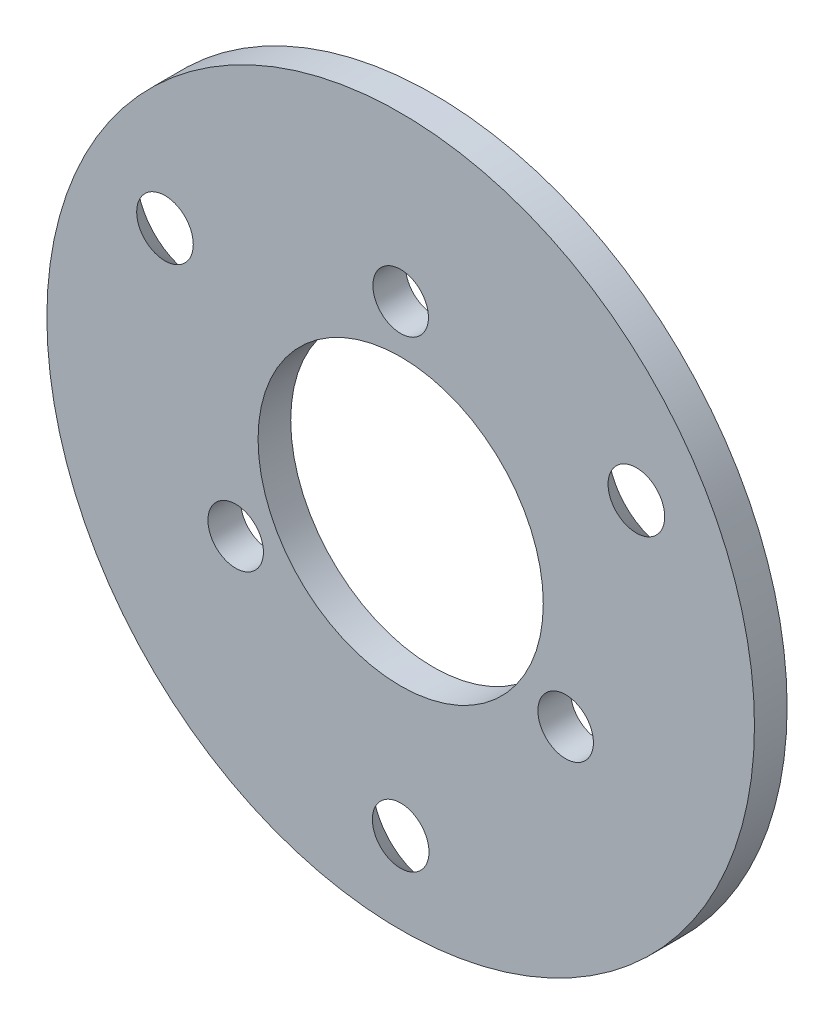
ISO-10303-21;
HEADER;
FILE_DESCRIPTION(('STEP AP214'),'2;1');
FILE_NAME('part.step','',(''),(''),'','','');
FILE_SCHEMA(('AUTOMOTIVE_DESIGN { 1 0 10303 214 1 1 1 1 }'));
ENDSEC;
DATA;
#1=APPLICATION_CONTEXT('core data for automotive mechanical design processes');
#2=APPLICATION_PROTOCOL_DEFINITION('international standard','automotive_design',2000,#1);
#3=PRODUCT_CONTEXT('',#1,'mechanical');
#4=PRODUCT('Part','Part','',(#3));
#5=PRODUCT_RELATED_PRODUCT_CATEGORY('part','',(#4));
#6=PRODUCT_DEFINITION_FORMATION('','',#4);
#7=PRODUCT_DEFINITION_CONTEXT('part definition',#1,'design');
#8=PRODUCT_DEFINITION('design','',#6,#7);
#9=PRODUCT_DEFINITION_SHAPE('','',#8);
#10=(LENGTH_UNIT() NAMED_UNIT(*) SI_UNIT(.MILLI.,.METRE.));
#11=(NAMED_UNIT(*) PLANE_ANGLE_UNIT() SI_UNIT($,.RADIAN.));
#12=(NAMED_UNIT(*) SI_UNIT($,.STERADIAN.) SOLID_ANGLE_UNIT());
#13=UNCERTAINTY_MEASURE_WITH_UNIT(LENGTH_MEASURE(1.E-05),#10,'distance_accuracy_value','');
#14=(GEOMETRIC_REPRESENTATION_CONTEXT(3) GLOBAL_UNCERTAINTY_ASSIGNED_CONTEXT((#13)) GLOBAL_UNIT_ASSIGNED_CONTEXT((#10,
#11,#12)) REPRESENTATION_CONTEXT('',''));
#15=CARTESIAN_POINT('',(0.,0.,0.));
#16=DIRECTION('',(0.,0.,1.));
#17=DIRECTION('',(1.,0.,0.));
#18=AXIS2_PLACEMENT_3D('',#15,#16,#17);
#19=CARTESIAN_POINT('',(0.,0.,0.));
#20=DIRECTION('',(0.,0.,1.));
#21=DIRECTION('',(1.,0.,0.));
#22=AXIS2_PLACEMENT_3D('',#19,#20,#21);
#23=PLANE('',#22);
#24=CARTESIAN_POINT('',(21.650635094611,12.5,0.));
#25=DIRECTION('',(0.,0.,-1.));
#26=DIRECTION('',(-1.,0.,0.));
#27=AXIS2_PLACEMENT_3D('',#24,#25,#26);
#28=CIRCLE('',#27,5.6);
#29=CARTESIAN_POINT('',(16.050635094611,12.5,0.));
#30=VERTEX_POINT('',#29);
#31=EDGE_CURVE('E83',#30,#30,#28,.T.);
#32=ORIENTED_EDGE('',*,*,#31,.F.);
#33=EDGE_LOOP('',(#32));
#34=FACE_BOUND('',#33,.T.);
#35=CARTESIAN_POINT('',(-15.1554445662277,-8.75000000000001,0.));
#36=DIRECTION('',(0.,0.,1.));
#37=DIRECTION('',(1.,0.,0.));
#38=AXIS2_PLACEMENT_3D('',#35,#36,#37);
#39=CIRCLE('',#38,2.55);
#40=CARTESIAN_POINT('',(-12.6054445662277,-8.75000000000001,0.));
#41=VERTEX_POINT('',#40);
#42=EDGE_CURVE('E63',#41,#41,#39,.T.);
#43=ORIENTED_EDGE('',*,*,#42,.T.);
#44=EDGE_LOOP('',(#43));
#45=FACE_BOUND('',#44,.T.);
#46=CARTESIAN_POINT('',(15.1554445662277,-8.75,0.));
#47=DIRECTION('',(0.,0.,1.));
#48=DIRECTION('',(1.,0.,0.));
#49=AXIS2_PLACEMENT_3D('',#46,#47,#48);
#50=CIRCLE('',#49,2.55);
#51=CARTESIAN_POINT('',(17.7054445662277,-8.75,0.));
#52=VERTEX_POINT('',#51);
#53=EDGE_CURVE('E57',#52,#52,#50,.T.);
#54=ORIENTED_EDGE('',*,*,#53,.T.);
#55=EDGE_LOOP('',(#54));
#56=FACE_BOUND('',#55,.T.);
#57=CARTESIAN_POINT('',(0.,0.,0.));
#58=DIRECTION('',(0.,0.,1.));
#59=DIRECTION('',(1.,0.,0.));
#60=AXIS2_PLACEMENT_3D('',#57,#58,#59);
#61=CIRCLE('',#60,13.1);
#62=CARTESIAN_POINT('',(13.1,0.,0.));
#63=VERTEX_POINT('',#62);
#64=EDGE_CURVE('E51',#63,#63,#61,.T.);
#65=ORIENTED_EDGE('',*,*,#64,.T.);
#66=EDGE_LOOP('',(#65));
#67=FACE_BOUND('',#66,.T.);
#68=CARTESIAN_POINT('',(0.,17.5,0.));
#69=DIRECTION('',(0.,0.,1.));
#70=DIRECTION('',(1.,0.,0.));
#71=AXIS2_PLACEMENT_3D('',#68,#69,#70);
#72=CIRCLE('',#71,2.55);
#73=CARTESIAN_POINT('',(2.55,17.5,0.));
#74=VERTEX_POINT('',#73);
#75=EDGE_CURVE('E45',#74,#74,#72,.T.);
#76=ORIENTED_EDGE('',*,*,#75,.T.);
#77=EDGE_LOOP('',(#76));
#78=FACE_BOUND('',#77,.T.);
#79=CARTESIAN_POINT('',(0.,0.,0.));
#80=DIRECTION('',(0.,0.,1.));
#81=DIRECTION('',(1.,0.,0.));
#82=AXIS2_PLACEMENT_3D('',#79,#80,#81);
#83=CIRCLE('',#82,32.5);
#84=CARTESIAN_POINT('',(32.5,0.,0.));
#85=VERTEX_POINT('',#84);
#86=EDGE_CURVE('E36',#85,#85,#83,.T.);
#87=ORIENTED_EDGE('',*,*,#86,.F.);
#88=EDGE_LOOP('',(#87));
#89=FACE_BOUND('',#88,.T.);
#90=CARTESIAN_POINT('',(0.,-25.,0.));
#91=DIRECTION('',(0.,0.,-1.));
#92=DIRECTION('',(-1.,0.,0.));
#93=AXIS2_PLACEMENT_3D('',#90,#91,#92);
#94=CIRCLE('',#93,5.6);
#95=CARTESIAN_POINT('',(-5.60000000000005,-25.,0.));
#96=VERTEX_POINT('',#95);
#97=EDGE_CURVE('E71',#96,#96,#94,.T.);
#98=ORIENTED_EDGE('',*,*,#97,.F.);
#99=EDGE_LOOP('',(#98));
#100=FACE_BOUND('',#99,.T.);
#101=CARTESIAN_POINT('',(-21.6506350946109,12.5,0.));
#102=DIRECTION('',(0.,0.,-1.));
#103=DIRECTION('',(-1.,0.,0.));
#104=AXIS2_PLACEMENT_3D('',#101,#102,#103);
#105=CIRCLE('',#104,5.6);
#106=CARTESIAN_POINT('',(-27.2506350946109,12.5,0.));
#107=VERTEX_POINT('',#106);
#108=EDGE_CURVE('E77',#107,#107,#105,.T.);
#109=ORIENTED_EDGE('',*,*,#108,.F.);
#110=EDGE_LOOP('',(#109));
#111=FACE_BOUND('',#110,.T.);
#112=ADVANCED_FACE('F32',(#34,#45,#56,#67,#78,#89,#100,#111),#23,.F.);
#113=CARTESIAN_POINT('',(0.,0.,3.));
#114=DIRECTION('',(0.,0.,1.));
#115=DIRECTION('',(1.,0.,0.));
#116=AXIS2_PLACEMENT_3D('',#113,#114,#115);
#117=PLANE('',#116);
#118=CARTESIAN_POINT('',(21.650635094611,12.5,3.));
#119=DIRECTION('',(0.,0.,1.));
#120=DIRECTION('',(1.,0.,0.));
#121=AXIS2_PLACEMENT_3D('',#118,#119,#120);
#122=CIRCLE('',#121,2.59999999999999);
#123=CARTESIAN_POINT('',(24.250635094611,12.5,3.));
#124=VERTEX_POINT('',#123);
#125=EDGE_CURVE('E80',#124,#124,#122,.T.);
#126=ORIENTED_EDGE('',*,*,#125,.F.);
#127=EDGE_LOOP('',(#126));
#128=FACE_BOUND('',#127,.T.);
#129=CARTESIAN_POINT('',(-21.6506350946109,12.5,3.));
#130=DIRECTION('',(0.,0.,1.));
#131=DIRECTION('',(1.,0.,0.));
#132=AXIS2_PLACEMENT_3D('',#129,#130,#131);
#133=CIRCLE('',#132,2.59999999999999);
#134=CARTESIAN_POINT('',(-19.050635094611,12.5,3.));
#135=VERTEX_POINT('',#134);
#136=EDGE_CURVE('E74',#135,#135,#133,.T.);
#137=ORIENTED_EDGE('',*,*,#136,.F.);
#138=EDGE_LOOP('',(#137));
#139=FACE_BOUND('',#138,.T.);
#140=CARTESIAN_POINT('',(0.,-25.,3.));
#141=DIRECTION('',(0.,0.,1.));
#142=DIRECTION('',(1.,0.,0.));
#143=AXIS2_PLACEMENT_3D('',#140,#141,#142);
#144=CIRCLE('',#143,2.59999999999999);
#145=CARTESIAN_POINT('',(2.59999999999994,-25.,3.));
#146=VERTEX_POINT('',#145);
#147=EDGE_CURVE('E66',#146,#146,#144,.T.);
#148=ORIENTED_EDGE('',*,*,#147,.F.);
#149=EDGE_LOOP('',(#148));
#150=FACE_BOUND('',#149,.T.);
#151=CARTESIAN_POINT('',(-15.1554445662277,-8.75000000000001,3.));
#152=DIRECTION('',(0.,0.,1.));
#153=DIRECTION('',(1.,0.,0.));
#154=AXIS2_PLACEMENT_3D('',#151,#152,#153);
#155=CIRCLE('',#154,2.55);
#156=CARTESIAN_POINT('',(-12.6054445662277,-8.75000000000001,3.));
#157=VERTEX_POINT('',#156);
#158=EDGE_CURVE('E60',#157,#157,#155,.T.);
#159=ORIENTED_EDGE('',*,*,#158,.F.);
#160=EDGE_LOOP('',(#159));
#161=FACE_BOUND('',#160,.T.);
#162=CARTESIAN_POINT('',(0.,0.,3.));
#163=DIRECTION('',(0.,0.,1.));
#164=DIRECTION('',(1.,0.,0.));
#165=AXIS2_PLACEMENT_3D('',#162,#163,#164);
#166=CIRCLE('',#165,13.1);
#167=CARTESIAN_POINT('',(13.1,0.,3.));
#168=VERTEX_POINT('',#167);
#169=EDGE_CURVE('E48',#168,#168,#166,.T.);
#170=ORIENTED_EDGE('',*,*,#169,.F.);
#171=EDGE_LOOP('',(#170));
#172=FACE_BOUND('',#171,.T.);
#173=CARTESIAN_POINT('',(0.,0.,3.));
#174=DIRECTION('',(0.,0.,1.));
#175=DIRECTION('',(1.,0.,0.));
#176=AXIS2_PLACEMENT_3D('',#173,#174,#175);
#177=CIRCLE('',#176,32.5);
#178=CARTESIAN_POINT('',(32.5,0.,3.));
#179=VERTEX_POINT('',#178);
#180=EDGE_CURVE('E10',#179,#179,#177,.T.);
#181=ORIENTED_EDGE('',*,*,#180,.T.);
#182=EDGE_LOOP('',(#181));
#183=FACE_BOUND('',#182,.T.);
#184=CARTESIAN_POINT('',(0.,17.5,3.));
#185=DIRECTION('',(0.,0.,1.));
#186=DIRECTION('',(1.,0.,0.));
#187=AXIS2_PLACEMENT_3D('',#184,#185,#186);
#188=CIRCLE('',#187,2.55);
#189=CARTESIAN_POINT('',(2.55,17.5,3.));
#190=VERTEX_POINT('',#189);
#191=EDGE_CURVE('E43',#190,#190,#188,.T.);
#192=ORIENTED_EDGE('',*,*,#191,.F.);
#193=EDGE_LOOP('',(#192));
#194=FACE_BOUND('',#193,.T.);
#195=CARTESIAN_POINT('',(15.1554445662277,-8.75,3.));
#196=DIRECTION('',(0.,0.,1.));
#197=DIRECTION('',(1.,0.,0.));
#198=AXIS2_PLACEMENT_3D('',#195,#196,#197);
#199=CIRCLE('',#198,2.55);
#200=CARTESIAN_POINT('',(17.7054445662277,-8.75,3.));
#201=VERTEX_POINT('',#200);
#202=EDGE_CURVE('E54',#201,#201,#199,.T.);
#203=ORIENTED_EDGE('',*,*,#202,.F.);
#204=EDGE_LOOP('',(#203));
#205=FACE_BOUND('',#204,.T.);
#206=ADVANCED_FACE('F91',(#128,#139,#150,#161,#172,#183,#194,#205),#117,.T.);
#207=CARTESIAN_POINT('',(0.,0.,3.));
#208=DIRECTION('',(0.,0.,-1.));
#209=DIRECTION('',(-1.,0.,0.));
#210=AXIS2_PLACEMENT_3D('',#207,#208,#209);
#211=CYLINDRICAL_SURFACE('',#210,32.5);
#212=ORIENTED_EDGE('',*,*,#180,.F.);
#213=EDGE_LOOP('',(#212));
#214=FACE_BOUND('',#213,.T.);
#215=ORIENTED_EDGE('',*,*,#86,.T.);
#216=EDGE_LOOP('',(#215));
#217=FACE_BOUND('',#216,.T.);
#218=ADVANCED_FACE('F34',(#214,#217),#211,.T.);
#219=CARTESIAN_POINT('',(0.,17.5,3.));
#220=DIRECTION('',(0.,0.,-1.));
#221=DIRECTION('',(-1.,0.,0.));
#222=AXIS2_PLACEMENT_3D('',#219,#220,#221);
#223=CYLINDRICAL_SURFACE('',#222,2.55);
#224=ORIENTED_EDGE('',*,*,#191,.T.);
#225=EDGE_LOOP('',(#224));
#226=FACE_BOUND('',#225,.T.);
#227=ORIENTED_EDGE('',*,*,#75,.F.);
#228=EDGE_LOOP('',(#227));
#229=FACE_BOUND('',#228,.T.);
#230=ADVANCED_FACE('F131',(#226,#229),#223,.F.);
#231=CARTESIAN_POINT('',(0.,0.,3.));
#232=DIRECTION('',(0.,0.,-1.));
#233=DIRECTION('',(-1.,0.,0.));
#234=AXIS2_PLACEMENT_3D('',#231,#232,#233);
#235=CYLINDRICAL_SURFACE('',#234,13.1);
#236=ORIENTED_EDGE('',*,*,#169,.T.);
#237=EDGE_LOOP('',(#236));
#238=FACE_BOUND('',#237,.T.);
#239=ORIENTED_EDGE('',*,*,#64,.F.);
#240=EDGE_LOOP('',(#239));
#241=FACE_BOUND('',#240,.T.);
#242=ADVANCED_FACE('F127',(#238,#241),#235,.F.);
#243=CARTESIAN_POINT('',(15.1554445662277,-8.75,3.));
#244=DIRECTION('',(0.,0.,-1.));
#245=DIRECTION('',(-1.,0.,0.));
#246=AXIS2_PLACEMENT_3D('',#243,#244,#245);
#247=CYLINDRICAL_SURFACE('',#246,2.55);
#248=ORIENTED_EDGE('',*,*,#202,.T.);
#249=EDGE_LOOP('',(#248));
#250=FACE_BOUND('',#249,.T.);
#251=ORIENTED_EDGE('',*,*,#53,.F.);
#252=EDGE_LOOP('',(#251));
#253=FACE_BOUND('',#252,.T.);
#254=ADVANCED_FACE('F123',(#250,#253),#247,.F.);
#255=CARTESIAN_POINT('',(-15.1554445662277,-8.75000000000001,3.));
#256=DIRECTION('',(0.,0.,-1.));
#257=DIRECTION('',(-1.,0.,0.));
#258=AXIS2_PLACEMENT_3D('',#255,#256,#257);
#259=CYLINDRICAL_SURFACE('',#258,2.55);
#260=ORIENTED_EDGE('',*,*,#158,.T.);
#261=EDGE_LOOP('',(#260));
#262=FACE_BOUND('',#261,.T.);
#263=ORIENTED_EDGE('',*,*,#42,.F.);
#264=EDGE_LOOP('',(#263));
#265=FACE_BOUND('',#264,.T.);
#266=ADVANCED_FACE('F117',(#262,#265),#259,.F.);
#267=CARTESIAN_POINT('',(0.,-25.,0.));
#268=DIRECTION('',(0.,0.,-1.));
#269=DIRECTION('',(-1.,0.,0.));
#270=AXIS2_PLACEMENT_3D('',#267,#268,#269);
#271=CONICAL_SURFACE('',#270,5.6,0.785398163397449);
#272=ORIENTED_EDGE('',*,*,#147,.T.);
#273=EDGE_LOOP('',(#272));
#274=FACE_BOUND('',#273,.T.);
#275=ORIENTED_EDGE('',*,*,#97,.T.);
#276=EDGE_LOOP('',(#275));
#277=FACE_BOUND('',#276,.T.);
#278=ADVANCED_FACE('F108',(#274,#277),#271,.F.);
#279=CARTESIAN_POINT('',(-21.6506350946109,12.5,0.));
#280=DIRECTION('',(0.,0.,-1.));
#281=DIRECTION('',(-1.,0.,0.));
#282=AXIS2_PLACEMENT_3D('',#279,#280,#281);
#283=CONICAL_SURFACE('',#282,5.6,0.785398163397449);
#284=ORIENTED_EDGE('',*,*,#136,.T.);
#285=EDGE_LOOP('',(#284));
#286=FACE_BOUND('',#285,.T.);
#287=ORIENTED_EDGE('',*,*,#108,.T.);
#288=EDGE_LOOP('',(#287));
#289=FACE_BOUND('',#288,.T.);
#290=ADVANCED_FACE('F106',(#286,#289),#283,.F.);
#291=CARTESIAN_POINT('',(21.650635094611,12.5,0.));
#292=DIRECTION('',(0.,0.,-1.));
#293=DIRECTION('',(-1.,0.,0.));
#294=AXIS2_PLACEMENT_3D('',#291,#292,#293);
#295=CONICAL_SURFACE('',#294,5.6,0.785398163397449);
#296=ORIENTED_EDGE('',*,*,#125,.T.);
#297=EDGE_LOOP('',(#296));
#298=FACE_BOUND('',#297,.T.);
#299=ORIENTED_EDGE('',*,*,#31,.T.);
#300=EDGE_LOOP('',(#299));
#301=FACE_BOUND('',#300,.T.);
#302=ADVANCED_FACE('F87',(#298,#301),#295,.F.);
#303=CLOSED_SHELL('',(#112,#206,#218,#230,#242,#254,#266,#278,#290,#302));
#304=MANIFOLD_SOLID_BREP('B2',#303);
#305=ADVANCED_BREP_SHAPE_REPRESENTATION('',(#18,#304),#14);
#306=SHAPE_DEFINITION_REPRESENTATION(#9,#305);
ENDSEC;
END-ISO-10303-21;
